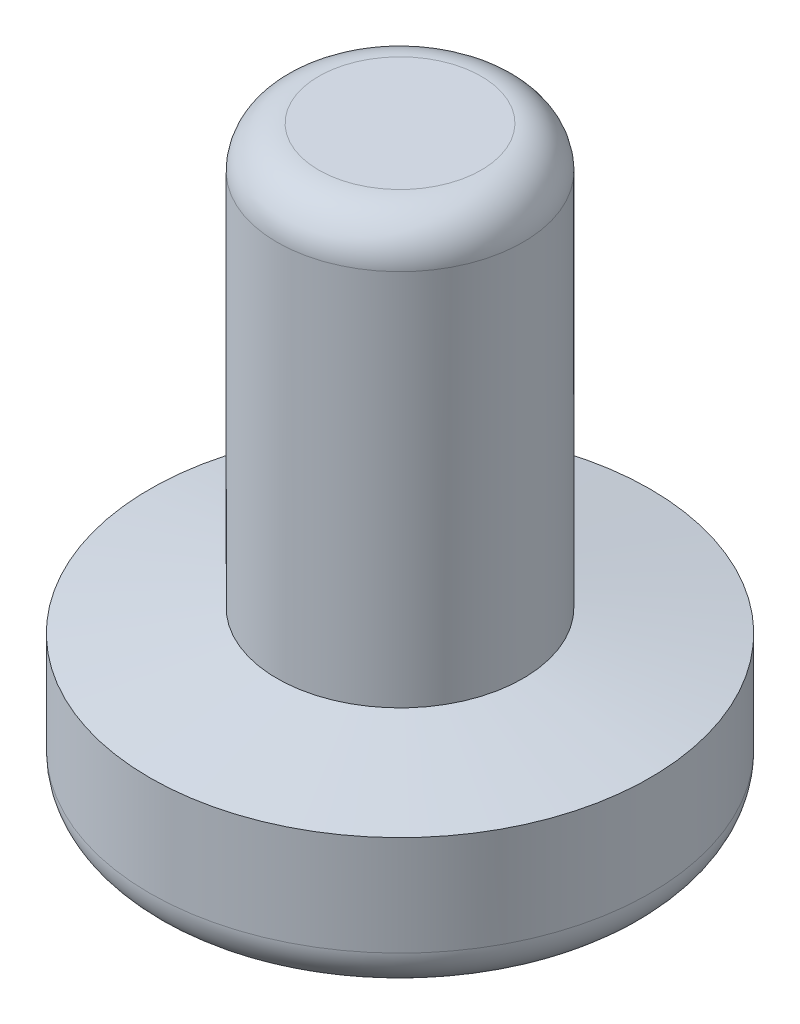
ISO-10303-21;
HEADER;
FILE_DESCRIPTION(('STEP AP214'),'2;1');
FILE_NAME('part.step','',(''),(''),'','','');
FILE_SCHEMA(('AUTOMOTIVE_DESIGN { 1 0 10303 214 1 1 1 1 }'));
ENDSEC;
DATA;
#1=APPLICATION_CONTEXT('core data for automotive mechanical design processes');
#2=APPLICATION_PROTOCOL_DEFINITION('international standard','automotive_design',2000,#1);
#3=PRODUCT_CONTEXT('',#1,'mechanical');
#4=PRODUCT('Part','Part','',(#3));
#5=PRODUCT_RELATED_PRODUCT_CATEGORY('part','',(#4));
#6=PRODUCT_DEFINITION_FORMATION('','',#4);
#7=PRODUCT_DEFINITION_CONTEXT('part definition',#1,'design');
#8=PRODUCT_DEFINITION('design','',#6,#7);
#9=PRODUCT_DEFINITION_SHAPE('','',#8);
#10=(LENGTH_UNIT() NAMED_UNIT(*) SI_UNIT(.MILLI.,.METRE.));
#11=(NAMED_UNIT(*) PLANE_ANGLE_UNIT() SI_UNIT($,.RADIAN.));
#12=(NAMED_UNIT(*) SI_UNIT($,.STERADIAN.) SOLID_ANGLE_UNIT());
#13=UNCERTAINTY_MEASURE_WITH_UNIT(LENGTH_MEASURE(1.E-05),#10,'distance_accuracy_value','');
#14=(GEOMETRIC_REPRESENTATION_CONTEXT(3) GLOBAL_UNCERTAINTY_ASSIGNED_CONTEXT((#13)) GLOBAL_UNIT_ASSIGNED_CONTEXT((#10,
#11,#12)) REPRESENTATION_CONTEXT('',''));
#15=CARTESIAN_POINT('',(0.,0.,0.));
#16=DIRECTION('',(0.,0.,1.));
#17=DIRECTION('',(1.,0.,0.));
#18=AXIS2_PLACEMENT_3D('',#15,#16,#17);
#19=CARTESIAN_POINT('',(0.,2.,0.));
#20=DIRECTION('',(0.,-1.,0.));
#21=DIRECTION('',(0.,0.,-1.));
#22=AXIS2_PLACEMENT_3D('',#19,#20,#21);
#23=CYLINDRICAL_SURFACE('',#22,3.);
#24=CARTESIAN_POINT('',(0.,0.5,0.));
#25=DIRECTION('',(0.,1.,0.));
#26=DIRECTION('',(0.,0.,1.));
#27=AXIS2_PLACEMENT_3D('',#24,#25,#26);
#28=CIRCLE('',#27,3.);
#29=CARTESIAN_POINT('',(0.,0.5,3.));
#30=VERTEX_POINT('',#29);
#31=EDGE_CURVE('E40',#30,#30,#28,.T.);
#32=ORIENTED_EDGE('',*,*,#31,.T.);
#33=EDGE_LOOP('',(#32));
#34=FACE_BOUND('',#33,.T.);
#35=CARTESIAN_POINT('',(0.,1.69999999999999,0.));
#36=DIRECTION('',(0.,1.,0.));
#37=DIRECTION('',(0.,0.,1.));
#38=AXIS2_PLACEMENT_3D('',#35,#36,#37);
#39=CIRCLE('',#38,3.);
#40=CARTESIAN_POINT('',(0.,1.69999999999999,3.));
#41=VERTEX_POINT('',#40);
#42=EDGE_CURVE('E56',#41,#41,#39,.F.);
#43=ORIENTED_EDGE('',*,*,#42,.T.);
#44=EDGE_LOOP('',(#43));
#45=FACE_BOUND('',#44,.T.);
#46=ADVANCED_FACE('F33',(#34,#45),#23,.T.);
#47=CARTESIAN_POINT('',(0.,0.,0.));
#48=DIRECTION('',(0.,1.,0.));
#49=DIRECTION('',(0.,0.,1.));
#50=AXIS2_PLACEMENT_3D('',#47,#48,#49);
#51=PLANE('',#50);
#52=CARTESIAN_POINT('',(0.,0.,0.));
#53=DIRECTION('',(0.,1.,0.));
#54=DIRECTION('',(0.,0.,1.));
#55=AXIS2_PLACEMENT_3D('',#52,#53,#54);
#56=CIRCLE('',#55,2.5);
#57=CARTESIAN_POINT('',(0.,0.,2.5));
#58=VERTEX_POINT('',#57);
#59=EDGE_CURVE('E10',#58,#58,#56,.F.);
#60=ORIENTED_EDGE('',*,*,#59,.T.);
#61=EDGE_LOOP('',(#60));
#62=FACE_BOUND('',#61,.T.);
#63=ADVANCED_FACE('F71',(#62),#51,.F.);
#64=CARTESIAN_POINT('',(0.,7.,0.));
#65=DIRECTION('',(0.,-1.,0.));
#66=DIRECTION('',(0.,0.,-1.));
#67=AXIS2_PLACEMENT_3D('',#64,#65,#66);
#68=CYLINDRICAL_SURFACE('',#67,1.475);
#69=CARTESIAN_POINT('',(0.,6.5,0.));
#70=DIRECTION('',(0.,1.,0.));
#71=DIRECTION('',(0.,0.,1.));
#72=AXIS2_PLACEMENT_3D('',#69,#70,#71);
#73=CIRCLE('',#72,1.475);
#74=CARTESIAN_POINT('',(0.,6.5,1.475));
#75=VERTEX_POINT('',#74);
#76=EDGE_CURVE('E44',#75,#75,#73,.F.);
#77=ORIENTED_EDGE('',*,*,#76,.T.);
#78=EDGE_LOOP('',(#77));
#79=FACE_BOUND('',#78,.T.);
#80=CARTESIAN_POINT('',(0.,1.96889864558039,0.));
#81=DIRECTION('',(0.,-1.,0.));
#82=DIRECTION('',(0.,0.,-1.));
#83=AXIS2_PLACEMENT_3D('',#80,#81,#82);
#84=CIRCLE('',#83,1.475);
#85=CARTESIAN_POINT('',(0.,1.96889864558039,-1.475));
#86=VERTEX_POINT('',#85);
#87=EDGE_CURVE('E53',#86,#86,#84,.F.);
#88=ORIENTED_EDGE('',*,*,#87,.T.);
#89=EDGE_LOOP('',(#88));
#90=FACE_BOUND('',#89,.T.);
#91=ADVANCED_FACE('F69',(#79,#90),#68,.T.);
#92=CARTESIAN_POINT('',(0.,7.,0.));
#93=DIRECTION('',(0.,1.,0.));
#94=DIRECTION('',(0.,0.,1.));
#95=AXIS2_PLACEMENT_3D('',#92,#93,#94);
#96=PLANE('',#95);
#97=CARTESIAN_POINT('',(0.,7.,0.));
#98=DIRECTION('',(0.,1.,0.));
#99=DIRECTION('',(0.,0.,1.));
#100=AXIS2_PLACEMENT_3D('',#97,#98,#99);
#101=CIRCLE('',#100,0.975);
#102=CARTESIAN_POINT('',(0.,7.,0.975));
#103=VERTEX_POINT('',#102);
#104=EDGE_CURVE('E48',#103,#103,#101,.T.);
#105=ORIENTED_EDGE('',*,*,#104,.T.);
#106=EDGE_LOOP('',(#105));
#107=FACE_BOUND('',#106,.T.);
#108=ADVANCED_FACE('F65',(#107),#96,.T.);
#109=CARTESIAN_POINT('',(0.,2.,0.));
#110=DIRECTION('',(0.,-1.,0.));
#111=DIRECTION('',(0.,0.,-1.));
#112=AXIS2_PLACEMENT_3D('',#109,#110,#111);
#113=CONICAL_SURFACE('',#112,1.29861545411459,1.39626340159547);
#114=ORIENTED_EDGE('',*,*,#42,.F.);
#115=EDGE_LOOP('',(#114));
#116=FACE_BOUND('',#115,.T.);
#117=ORIENTED_EDGE('',*,*,#87,.F.);
#118=EDGE_LOOP('',(#117));
#119=FACE_BOUND('',#118,.T.);
#120=ADVANCED_FACE('F61',(#116,#119),#113,.T.);
#121=CARTESIAN_POINT('',(0.,6.5,0.));
#122=DIRECTION('',(0.,1.,0.));
#123=DIRECTION('',(0.,0.,1.));
#124=AXIS2_PLACEMENT_3D('',#121,#122,#123);
#125=TOROIDAL_SURFACE('',#124,0.975,0.5);
#126=ORIENTED_EDGE('',*,*,#76,.F.);
#127=EDGE_LOOP('',(#126));
#128=FACE_BOUND('',#127,.T.);
#129=ORIENTED_EDGE('',*,*,#104,.F.);
#130=EDGE_LOOP('',(#129));
#131=FACE_BOUND('',#130,.T.);
#132=ADVANCED_FACE('F64',(#128,#131),#125,.T.);
#133=CARTESIAN_POINT('',(0.,0.5,0.));
#134=DIRECTION('',(0.,1.,0.));
#135=DIRECTION('',(0.,0.,1.));
#136=AXIS2_PLACEMENT_3D('',#133,#134,#135);
#137=TOROIDAL_SURFACE('',#136,2.5,0.5);
#138=ORIENTED_EDGE('',*,*,#59,.F.);
#139=EDGE_LOOP('',(#138));
#140=FACE_BOUND('',#139,.T.);
#141=ORIENTED_EDGE('',*,*,#31,.F.);
#142=EDGE_LOOP('',(#141));
#143=FACE_BOUND('',#142,.T.);
#144=ADVANCED_FACE('F35',(#140,#143),#137,.T.);
#145=CLOSED_SHELL('',(#46,#63,#91,#108,#120,#132,#144));
#146=MANIFOLD_SOLID_BREP('B2',#145);
#147=ADVANCED_BREP_SHAPE_REPRESENTATION('',(#18,#146),#14);
#148=SHAPE_DEFINITION_REPRESENTATION(#9,#147);
ENDSEC;
END-ISO-10303-21;
